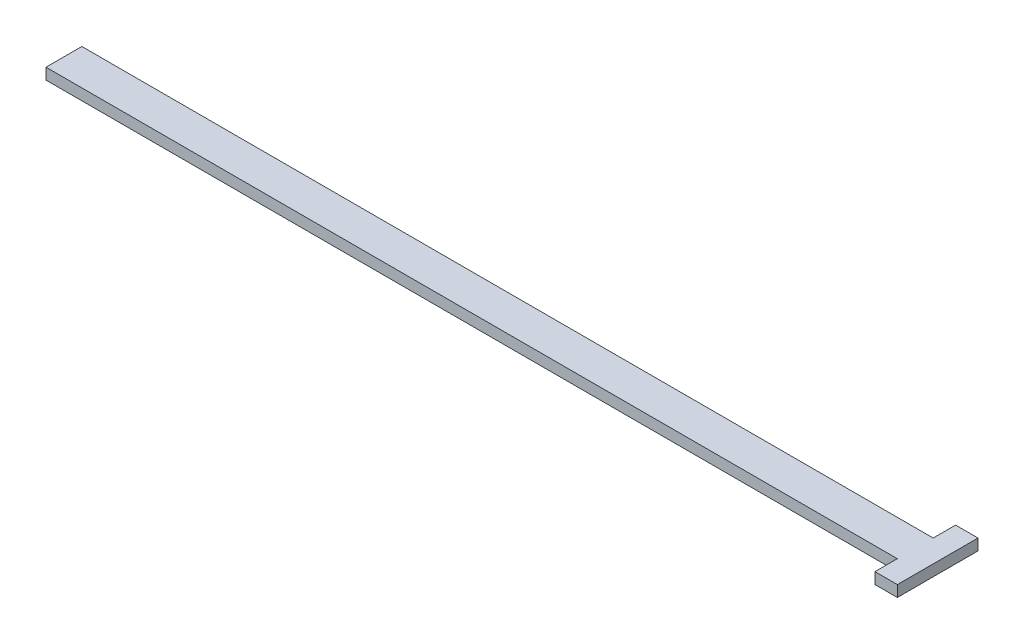
ISO-10303-21;
HEADER;
FILE_DESCRIPTION(('STEP AP214'),'2;1');
FILE_NAME('part.step','',(''),(''),'','','');
FILE_SCHEMA(('AUTOMOTIVE_DESIGN { 1 0 10303 214 1 1 1 1 }'));
ENDSEC;
DATA;
#1=APPLICATION_CONTEXT('core data for automotive mechanical design processes');
#2=APPLICATION_PROTOCOL_DEFINITION('international standard','automotive_design',2000,#1);
#3=PRODUCT_CONTEXT('',#1,'mechanical');
#4=PRODUCT('Part','Part','',(#3));
#5=PRODUCT_RELATED_PRODUCT_CATEGORY('part','',(#4));
#6=PRODUCT_DEFINITION_FORMATION('','',#4);
#7=PRODUCT_DEFINITION_CONTEXT('part definition',#1,'design');
#8=PRODUCT_DEFINITION('design','',#6,#7);
#9=PRODUCT_DEFINITION_SHAPE('','',#8);
#10=(LENGTH_UNIT() NAMED_UNIT(*) SI_UNIT(.MILLI.,.METRE.));
#11=(NAMED_UNIT(*) PLANE_ANGLE_UNIT() SI_UNIT($,.RADIAN.));
#12=(NAMED_UNIT(*) SI_UNIT($,.STERADIAN.) SOLID_ANGLE_UNIT());
#13=UNCERTAINTY_MEASURE_WITH_UNIT(LENGTH_MEASURE(1.E-05),#10,'distance_accuracy_value','');
#14=(GEOMETRIC_REPRESENTATION_CONTEXT(3) GLOBAL_UNCERTAINTY_ASSIGNED_CONTEXT((#13)) GLOBAL_UNIT_ASSIGNED_CONTEXT((#10,
#11,#12)) REPRESENTATION_CONTEXT('',''));
#15=CARTESIAN_POINT('',(0.,0.,0.));
#16=DIRECTION('',(0.,0.,1.));
#17=DIRECTION('',(1.,0.,0.));
#18=AXIS2_PLACEMENT_3D('',#15,#16,#17);
#19=CARTESIAN_POINT('',(123.825,3.175,-11.43));
#20=DIRECTION('',(-1.,0.,0.));
#21=DIRECTION('',(0.,0.,1.));
#22=AXIS2_PLACEMENT_3D('',#19,#20,#21);
#23=PLANE('',#22);
#24=DIRECTION('',(0.,0.,-1.));
#25=VECTOR('',#24,1.);
#26=CARTESIAN_POINT('',(123.825,0.,-11.43));
#27=LINE('',#26,#25);
#28=CARTESIAN_POINT('',(123.825,0.,11.43));
#29=VERTEX_POINT('',#28);
#30=CARTESIAN_POINT('',(123.825,0.,-11.43));
#31=VERTEX_POINT('',#30);
#32=EDGE_CURVE('E124',#29,#31,#27,.T.);
#33=ORIENTED_EDGE('',*,*,#32,.T.);
#34=DIRECTION('',(0.,-1.,0.));
#35=VECTOR('',#34,1.);
#36=CARTESIAN_POINT('',(123.825,3.175,-11.43));
#37=LINE('',#36,#35);
#38=CARTESIAN_POINT('',(123.825,3.175,-11.43));
#39=VERTEX_POINT('',#38);
#40=EDGE_CURVE('E11',#39,#31,#37,.T.);
#41=ORIENTED_EDGE('',*,*,#40,.F.);
#42=DIRECTION('',(0.,0.,-1.));
#43=VECTOR('',#42,1.);
#44=CARTESIAN_POINT('',(123.825,3.175,-11.43));
#45=LINE('',#44,#43);
#46=CARTESIAN_POINT('',(123.825,3.175,11.43));
#47=VERTEX_POINT('',#46);
#48=EDGE_CURVE('E121',#47,#39,#45,.T.);
#49=ORIENTED_EDGE('',*,*,#48,.F.);
#50=DIRECTION('',(0.,-1.,0.));
#51=VECTOR('',#50,1.);
#52=CARTESIAN_POINT('',(123.825,3.175,11.43));
#53=LINE('',#52,#51);
#54=EDGE_CURVE('E40',#47,#29,#53,.T.);
#55=ORIENTED_EDGE('',*,*,#54,.T.);
#56=EDGE_LOOP('',(#33,#41,#49,#55));
#57=FACE_BOUND('',#56,.T.);
#58=ADVANCED_FACE('F33',(#57),#23,.F.);
#59=CARTESIAN_POINT('',(-123.825,3.175,-11.43));
#60=DIRECTION('',(0.,0.,1.));
#61=DIRECTION('',(1.,0.,0.));
#62=AXIS2_PLACEMENT_3D('',#59,#60,#61);
#63=PLANE('',#62);
#64=DIRECTION('',(-1.,0.,0.));
#65=VECTOR('',#64,1.);
#66=CARTESIAN_POINT('',(-123.825,0.,-11.43));
#67=LINE('',#66,#65);
#68=CARTESIAN_POINT('',(117.475,0.,-11.43));
#69=VERTEX_POINT('',#68);
#70=EDGE_CURVE('E119',#31,#69,#67,.T.);
#71=ORIENTED_EDGE('',*,*,#70,.T.);
#72=DIRECTION('',(0.,1.,0.));
#73=VECTOR('',#72,1.);
#74=CARTESIAN_POINT('',(117.475,0.,-11.43));
#75=LINE('',#74,#73);
#76=CARTESIAN_POINT('',(117.475,3.175,-11.43));
#77=VERTEX_POINT('',#76);
#78=EDGE_CURVE('E142',#69,#77,#75,.T.);
#79=ORIENTED_EDGE('',*,*,#78,.T.);
#80=DIRECTION('',(-1.,0.,0.));
#81=VECTOR('',#80,1.);
#82=CARTESIAN_POINT('',(-123.825,3.175,-11.43));
#83=LINE('',#82,#81);
#84=EDGE_CURVE('E139',#39,#77,#83,.T.);
#85=ORIENTED_EDGE('',*,*,#84,.F.);
#86=ORIENTED_EDGE('',*,*,#40,.T.);
#87=EDGE_LOOP('',(#71,#79,#85,#86));
#88=FACE_BOUND('',#87,.T.);
#89=ADVANCED_FACE('F169',(#88),#63,.F.);
#90=CARTESIAN_POINT('',(-123.825,3.175,-11.43));
#91=DIRECTION('',(1.,0.,0.));
#92=DIRECTION('',(0.,0.,-1.));
#93=AXIS2_PLACEMENT_3D('',#90,#91,#92);
#94=PLANE('',#93);
#95=DIRECTION('',(0.,0.,1.));
#96=VECTOR('',#95,1.);
#97=CARTESIAN_POINT('',(-123.825,3.175,-11.43));
#98=LINE('',#97,#96);
#99=CARTESIAN_POINT('',(-123.825,3.175,-5.08));
#100=VERTEX_POINT('',#99);
#101=CARTESIAN_POINT('',(-123.825,3.175,5.08));
#102=VERTEX_POINT('',#101);
#103=EDGE_CURVE('E114',#100,#102,#98,.T.);
#104=ORIENTED_EDGE('',*,*,#103,.F.);
#105=DIRECTION('',(0.,1.,0.));
#106=VECTOR('',#105,1.);
#107=CARTESIAN_POINT('',(-123.825,0.,-5.08));
#108=LINE('',#107,#106);
#109=CARTESIAN_POINT('',(-123.825,0.,-5.08));
#110=VERTEX_POINT('',#109);
#111=EDGE_CURVE('E100',#110,#100,#108,.T.);
#112=ORIENTED_EDGE('',*,*,#111,.F.);
#113=DIRECTION('',(0.,0.,1.));
#114=VECTOR('',#113,1.);
#115=CARTESIAN_POINT('',(-123.825,0.,-11.43));
#116=LINE('',#115,#114);
#117=CARTESIAN_POINT('',(-123.825,0.,5.08));
#118=VERTEX_POINT('',#117);
#119=EDGE_CURVE('E112',#110,#118,#116,.T.);
#120=ORIENTED_EDGE('',*,*,#119,.T.);
#121=DIRECTION('',(0.,1.,0.));
#122=VECTOR('',#121,1.);
#123=CARTESIAN_POINT('',(-123.825,0.,5.08));
#124=LINE('',#123,#122);
#125=EDGE_CURVE('E161',#118,#102,#124,.T.);
#126=ORIENTED_EDGE('',*,*,#125,.T.);
#127=EDGE_LOOP('',(#104,#112,#120,#126));
#128=FACE_BOUND('',#127,.T.);
#129=ADVANCED_FACE('F110',(#128),#94,.F.);
#130=CARTESIAN_POINT('',(-123.825,3.175,11.43));
#131=DIRECTION('',(0.,0.,-1.));
#132=DIRECTION('',(-1.,0.,0.));
#133=AXIS2_PLACEMENT_3D('',#130,#131,#132);
#134=PLANE('',#133);
#135=DIRECTION('',(1.,0.,0.));
#136=VECTOR('',#135,1.);
#137=CARTESIAN_POINT('',(-123.825,3.175,11.43));
#138=LINE('',#137,#136);
#139=CARTESIAN_POINT('',(117.475,3.175,11.43));
#140=VERTEX_POINT('',#139);
#141=EDGE_CURVE('E128',#140,#47,#138,.T.);
#142=ORIENTED_EDGE('',*,*,#141,.F.);
#143=DIRECTION('',(0.,1.,0.));
#144=VECTOR('',#143,1.);
#145=CARTESIAN_POINT('',(117.475,0.,11.43));
#146=LINE('',#145,#144);
#147=CARTESIAN_POINT('',(117.475,0.,11.43));
#148=VERTEX_POINT('',#147);
#149=EDGE_CURVE('E156',#148,#140,#146,.T.);
#150=ORIENTED_EDGE('',*,*,#149,.F.);
#151=DIRECTION('',(1.,0.,0.));
#152=VECTOR('',#151,1.);
#153=CARTESIAN_POINT('',(-123.825,0.,11.43));
#154=LINE('',#153,#152);
#155=EDGE_CURVE('E118',#148,#29,#154,.T.);
#156=ORIENTED_EDGE('',*,*,#155,.T.);
#157=ORIENTED_EDGE('',*,*,#54,.F.);
#158=EDGE_LOOP('',(#142,#150,#156,#157));
#159=FACE_BOUND('',#158,.T.);
#160=ADVANCED_FACE('F177',(#159),#134,.F.);
#161=CARTESIAN_POINT('',(0.,3.175,0.));
#162=DIRECTION('',(0.,1.,0.));
#163=DIRECTION('',(0.,0.,1.));
#164=AXIS2_PLACEMENT_3D('',#161,#162,#163);
#165=PLANE('',#164);
#166=DIRECTION('',(0.,0.,-1.));
#167=VECTOR('',#166,1.);
#168=CARTESIAN_POINT('',(117.475,3.175,-11.43));
#169=LINE('',#168,#167);
#170=CARTESIAN_POINT('',(117.475,3.175,-5.08));
#171=VERTEX_POINT('',#170);
#172=EDGE_CURVE('E105',#171,#77,#169,.T.);
#173=ORIENTED_EDGE('',*,*,#172,.F.);
#174=DIRECTION('',(1.,0.,0.));
#175=VECTOR('',#174,1.);
#176=CARTESIAN_POINT('',(-123.825,3.175,-5.08));
#177=LINE('',#176,#175);
#178=EDGE_CURVE('E163',#100,#171,#177,.T.);
#179=ORIENTED_EDGE('',*,*,#178,.F.);
#180=ORIENTED_EDGE('',*,*,#103,.T.);
#181=DIRECTION('',(-1.,0.,0.));
#182=VECTOR('',#181,1.);
#183=CARTESIAN_POINT('',(-123.825,3.175,5.08));
#184=LINE('',#183,#182);
#185=CARTESIAN_POINT('',(117.475,3.175,5.08));
#186=VERTEX_POINT('',#185);
#187=EDGE_CURVE('E154',#186,#102,#184,.T.);
#188=ORIENTED_EDGE('',*,*,#187,.F.);
#189=DIRECTION('',(0.,0.,-1.));
#190=VECTOR('',#189,1.);
#191=CARTESIAN_POINT('',(117.475,3.175,11.43));
#192=LINE('',#191,#190);
#193=EDGE_CURVE('E157',#140,#186,#192,.T.);
#194=ORIENTED_EDGE('',*,*,#193,.F.);
#195=ORIENTED_EDGE('',*,*,#141,.T.);
#196=ORIENTED_EDGE('',*,*,#48,.T.);
#197=ORIENTED_EDGE('',*,*,#84,.T.);
#198=EDGE_LOOP('',(#173,#179,#180,#188,#194,#195,#196,#197));
#199=FACE_BOUND('',#198,.T.);
#200=ADVANCED_FACE('F168',(#199),#165,.T.);
#201=CARTESIAN_POINT('',(0.,0.,0.));
#202=DIRECTION('',(0.,1.,0.));
#203=DIRECTION('',(0.,0.,1.));
#204=AXIS2_PLACEMENT_3D('',#201,#202,#203);
#205=PLANE('',#204);
#206=DIRECTION('',(1.,0.,0.));
#207=VECTOR('',#206,1.);
#208=CARTESIAN_POINT('',(-123.825,0.,-5.08));
#209=LINE('',#208,#207);
#210=CARTESIAN_POINT('',(117.475,0.,-5.08));
#211=VERTEX_POINT('',#210);
#212=EDGE_CURVE('E96',#110,#211,#209,.T.);
#213=ORIENTED_EDGE('',*,*,#212,.T.);
#214=DIRECTION('',(0.,0.,-1.));
#215=VECTOR('',#214,1.);
#216=CARTESIAN_POINT('',(117.475,0.,-11.43));
#217=LINE('',#216,#215);
#218=EDGE_CURVE('E47',#211,#69,#217,.T.);
#219=ORIENTED_EDGE('',*,*,#218,.T.);
#220=ORIENTED_EDGE('',*,*,#70,.F.);
#221=ORIENTED_EDGE('',*,*,#32,.F.);
#222=ORIENTED_EDGE('',*,*,#155,.F.);
#223=DIRECTION('',(0.,0.,-1.));
#224=VECTOR('',#223,1.);
#225=CARTESIAN_POINT('',(117.475,0.,11.43));
#226=LINE('',#225,#224);
#227=CARTESIAN_POINT('',(117.475,0.,5.08));
#228=VERTEX_POINT('',#227);
#229=EDGE_CURVE('E152',#148,#228,#226,.T.);
#230=ORIENTED_EDGE('',*,*,#229,.T.);
#231=DIRECTION('',(-1.,0.,0.));
#232=VECTOR('',#231,1.);
#233=CARTESIAN_POINT('',(-123.825,0.,5.08));
#234=LINE('',#233,#232);
#235=EDGE_CURVE('E55',#228,#118,#234,.T.);
#236=ORIENTED_EDGE('',*,*,#235,.T.);
#237=ORIENTED_EDGE('',*,*,#119,.F.);
#238=EDGE_LOOP('',(#213,#219,#220,#221,#222,#230,#236,#237));
#239=FACE_BOUND('',#238,.T.);
#240=ADVANCED_FACE('F116',(#239),#205,.F.);
#241=CARTESIAN_POINT('',(-123.825,0.,5.08));
#242=DIRECTION('',(0.,0.,-1.));
#243=DIRECTION('',(-1.,0.,0.));
#244=AXIS2_PLACEMENT_3D('',#241,#242,#243);
#245=PLANE('',#244);
#246=ORIENTED_EDGE('',*,*,#187,.T.);
#247=ORIENTED_EDGE('',*,*,#125,.F.);
#248=ORIENTED_EDGE('',*,*,#235,.F.);
#249=DIRECTION('',(0.,1.,0.));
#250=VECTOR('',#249,1.);
#251=CARTESIAN_POINT('',(117.475,0.,5.08));
#252=LINE('',#251,#250);
#253=EDGE_CURVE('E164',#228,#186,#252,.T.);
#254=ORIENTED_EDGE('',*,*,#253,.T.);
#255=EDGE_LOOP('',(#246,#247,#248,#254));
#256=FACE_BOUND('',#255,.T.);
#257=ADVANCED_FACE('F185',(#256),#245,.F.);
#258=CARTESIAN_POINT('',(117.475,0.,11.43));
#259=DIRECTION('',(1.,0.,0.));
#260=DIRECTION('',(0.,0.,-1.));
#261=AXIS2_PLACEMENT_3D('',#258,#259,#260);
#262=PLANE('',#261);
#263=ORIENTED_EDGE('',*,*,#193,.T.);
#264=ORIENTED_EDGE('',*,*,#253,.F.);
#265=ORIENTED_EDGE('',*,*,#229,.F.);
#266=ORIENTED_EDGE('',*,*,#149,.T.);
#267=EDGE_LOOP('',(#263,#264,#265,#266));
#268=FACE_BOUND('',#267,.T.);
#269=ADVANCED_FACE('F188',(#268),#262,.F.);
#270=CARTESIAN_POINT('',(117.475,0.,-11.43));
#271=DIRECTION('',(1.,0.,0.));
#272=DIRECTION('',(0.,0.,-1.));
#273=AXIS2_PLACEMENT_3D('',#270,#271,#272);
#274=PLANE('',#273);
#275=ORIENTED_EDGE('',*,*,#172,.T.);
#276=ORIENTED_EDGE('',*,*,#78,.F.);
#277=ORIENTED_EDGE('',*,*,#218,.F.);
#278=DIRECTION('',(0.,1.,0.));
#279=VECTOR('',#278,1.);
#280=CARTESIAN_POINT('',(117.475,0.,-5.08));
#281=LINE('',#280,#279);
#282=EDGE_CURVE('E102',#211,#171,#281,.T.);
#283=ORIENTED_EDGE('',*,*,#282,.T.);
#284=EDGE_LOOP('',(#275,#276,#277,#283));
#285=FACE_BOUND('',#284,.T.);
#286=ADVANCED_FACE('F191',(#285),#274,.F.);
#287=CARTESIAN_POINT('',(-123.825,0.,-5.08));
#288=DIRECTION('',(0.,0.,1.));
#289=DIRECTION('',(1.,0.,0.));
#290=AXIS2_PLACEMENT_3D('',#287,#288,#289);
#291=PLANE('',#290);
#292=ORIENTED_EDGE('',*,*,#178,.T.);
#293=ORIENTED_EDGE('',*,*,#282,.F.);
#294=ORIENTED_EDGE('',*,*,#212,.F.);
#295=ORIENTED_EDGE('',*,*,#111,.T.);
#296=EDGE_LOOP('',(#292,#293,#294,#295));
#297=FACE_BOUND('',#296,.T.);
#298=ADVANCED_FACE('F99',(#297),#291,.F.);
#299=CLOSED_SHELL('',(#58,#89,#129,#160,#200,#240,#257,#269,#286,#298));
#300=MANIFOLD_SOLID_BREP('B2',#299);
#301=ADVANCED_BREP_SHAPE_REPRESENTATION('',(#18,#300),#14);
#302=SHAPE_DEFINITION_REPRESENTATION(#9,#301);
ENDSEC;
END-ISO-10303-21;
